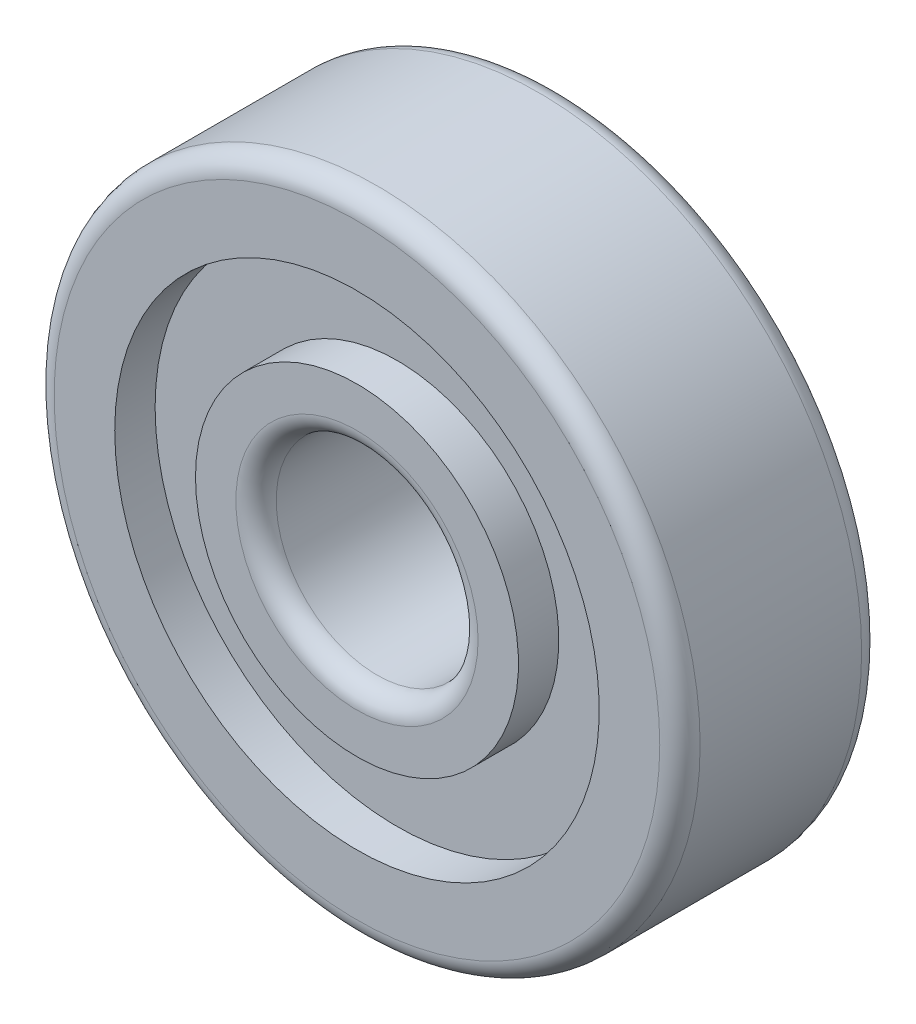
ISO-10303-21;
HEADER;
FILE_DESCRIPTION(('STEP AP214'),'2;1');
FILE_NAME('part.step','',(''),(''),'','','');
FILE_SCHEMA(('AUTOMOTIVE_DESIGN { 1 0 10303 214 1 1 1 1 }'));
ENDSEC;
DATA;
#1=APPLICATION_CONTEXT('core data for automotive mechanical design processes');
#2=APPLICATION_PROTOCOL_DEFINITION('international standard','automotive_design',2000,#1);
#3=PRODUCT_CONTEXT('',#1,'mechanical');
#4=PRODUCT('Part','Part','',(#3));
#5=PRODUCT_RELATED_PRODUCT_CATEGORY('part','',(#4));
#6=PRODUCT_DEFINITION_FORMATION('','',#4);
#7=PRODUCT_DEFINITION_CONTEXT('part definition',#1,'design');
#8=PRODUCT_DEFINITION('design','',#6,#7);
#9=PRODUCT_DEFINITION_SHAPE('','',#8);
#10=(LENGTH_UNIT() NAMED_UNIT(*) SI_UNIT(.MILLI.,.METRE.));
#11=(NAMED_UNIT(*) PLANE_ANGLE_UNIT() SI_UNIT($,.RADIAN.));
#12=(NAMED_UNIT(*) SI_UNIT($,.STERADIAN.) SOLID_ANGLE_UNIT());
#13=UNCERTAINTY_MEASURE_WITH_UNIT(LENGTH_MEASURE(1.E-05),#10,'distance_accuracy_value','');
#14=(GEOMETRIC_REPRESENTATION_CONTEXT(3) GLOBAL_UNCERTAINTY_ASSIGNED_CONTEXT((#13)) GLOBAL_UNIT_ASSIGNED_CONTEXT((#10,
#11,#12)) REPRESENTATION_CONTEXT('',''));
#15=CARTESIAN_POINT('',(0.,0.,0.));
#16=DIRECTION('',(0.,0.,1.));
#17=DIRECTION('',(1.,0.,0.));
#18=AXIS2_PLACEMENT_3D('',#15,#16,#17);
#19=CARTESIAN_POINT('',(0.,0.,2.5));
#20=DIRECTION('',(0.,0.,1.));
#21=DIRECTION('',(1.,0.,0.));
#22=AXIS2_PLACEMENT_3D('',#19,#20,#21);
#23=PLANE('',#22);
#24=CARTESIAN_POINT('',(0.,0.,2.5));
#25=DIRECTION('',(0.,0.,1.));
#26=DIRECTION('',(1.,0.,0.));
#27=AXIS2_PLACEMENT_3D('',#24,#25,#26);
#28=CIRCLE('',#27,3.);
#29=CARTESIAN_POINT('',(3.,0.,2.5));
#30=VERTEX_POINT('',#29);
#31=EDGE_CURVE('E45',#30,#30,#28,.F.);
#32=ORIENTED_EDGE('',*,*,#31,.T.);
#33=EDGE_LOOP('',(#32));
#34=FACE_BOUND('',#33,.T.);
#35=CARTESIAN_POINT('',(0.,0.,2.5));
#36=DIRECTION('',(0.,0.,-1.));
#37=DIRECTION('',(-1.,0.,0.));
#38=AXIS2_PLACEMENT_3D('',#35,#36,#37);
#39=CIRCLE('',#38,4.);
#40=CARTESIAN_POINT('',(-4.,0.,2.5));
#41=VERTEX_POINT('',#40);
#42=EDGE_CURVE('E85',#41,#41,#39,.T.);
#43=ORIENTED_EDGE('',*,*,#42,.F.);
#44=EDGE_LOOP('',(#43));
#45=FACE_BOUND('',#44,.T.);
#46=ADVANCED_FACE('F34',(#34,#45),#23,.T.);
#47=CARTESIAN_POINT('',(0.,0.,-2.5));
#48=DIRECTION('',(0.,0.,1.));
#49=DIRECTION('',(1.,0.,0.));
#50=AXIS2_PLACEMENT_3D('',#47,#48,#49);
#51=PLANE('',#50);
#52=CARTESIAN_POINT('',(0.,0.,-2.5));
#53=DIRECTION('',(0.,0.,1.));
#54=DIRECTION('',(1.,0.,0.));
#55=AXIS2_PLACEMENT_3D('',#52,#53,#54);
#56=CIRCLE('',#55,3.);
#57=CARTESIAN_POINT('',(3.,0.,-2.5));
#58=VERTEX_POINT('',#57);
#59=EDGE_CURVE('E60',#58,#58,#56,.T.);
#60=ORIENTED_EDGE('',*,*,#59,.T.);
#61=EDGE_LOOP('',(#60));
#62=FACE_BOUND('',#61,.T.);
#63=CARTESIAN_POINT('',(0.,0.,-2.5));
#64=DIRECTION('',(0.,0.,-1.));
#65=DIRECTION('',(-1.,0.,0.));
#66=AXIS2_PLACEMENT_3D('',#63,#64,#65);
#67=CIRCLE('',#66,4.);
#68=CARTESIAN_POINT('',(-4.,0.,-2.5));
#69=VERTEX_POINT('',#68);
#70=EDGE_CURVE('E73',#69,#69,#67,.T.);
#71=ORIENTED_EDGE('',*,*,#70,.T.);
#72=EDGE_LOOP('',(#71));
#73=FACE_BOUND('',#72,.T.);
#74=ADVANCED_FACE('F101',(#62,#73),#51,.F.);
#75=CARTESIAN_POINT('',(0.,0.,2.5));
#76=DIRECTION('',(0.,0.,-1.));
#77=DIRECTION('',(-1.,0.,0.));
#78=AXIS2_PLACEMENT_3D('',#75,#76,#77);
#79=CIRCLE('',#78,6.);
#80=CARTESIAN_POINT('',(-6.,0.,2.5));
#81=VERTEX_POINT('',#80);
#82=EDGE_CURVE('E79',#81,#81,#79,.T.);
#83=ORIENTED_EDGE('',*,*,#82,.T.);
#84=EDGE_LOOP('',(#83));
#85=FACE_BOUND('',#84,.T.);
#86=CARTESIAN_POINT('',(0.,0.,2.5));
#87=DIRECTION('',(0.,0.,1.));
#88=DIRECTION('',(1.,0.,0.));
#89=AXIS2_PLACEMENT_3D('',#86,#87,#88);
#90=CIRCLE('',#89,7.5);
#91=CARTESIAN_POINT('',(7.5,0.,2.5));
#92=VERTEX_POINT('',#91);
#93=EDGE_CURVE('E49',#92,#92,#90,.T.);
#94=ORIENTED_EDGE('',*,*,#93,.T.);
#95=EDGE_LOOP('',(#94));
#96=FACE_BOUND('',#95,.T.);
#97=ADVANCED_FACE('F104',(#85,#96),#23,.T.);
#98=CARTESIAN_POINT('',(0.,0.,-2.5));
#99=DIRECTION('',(0.,0.,-1.));
#100=DIRECTION('',(-1.,0.,0.));
#101=AXIS2_PLACEMENT_3D('',#98,#99,#100);
#102=CIRCLE('',#101,6.);
#103=CARTESIAN_POINT('',(-6.,0.,-2.5));
#104=VERTEX_POINT('',#103);
#105=EDGE_CURVE('E67',#104,#104,#102,.T.);
#106=ORIENTED_EDGE('',*,*,#105,.F.);
#107=EDGE_LOOP('',(#106));
#108=FACE_BOUND('',#107,.T.);
#109=CARTESIAN_POINT('',(0.,0.,-2.5));
#110=DIRECTION('',(0.,0.,1.));
#111=DIRECTION('',(1.,0.,0.));
#112=AXIS2_PLACEMENT_3D('',#109,#110,#111);
#113=CIRCLE('',#112,7.5);
#114=CARTESIAN_POINT('',(7.5,0.,-2.5));
#115=VERTEX_POINT('',#114);
#116=EDGE_CURVE('E63',#115,#115,#113,.F.);
#117=ORIENTED_EDGE('',*,*,#116,.T.);
#118=EDGE_LOOP('',(#117));
#119=FACE_BOUND('',#118,.T.);
#120=ADVANCED_FACE('F110',(#108,#119),#51,.F.);
#121=CARTESIAN_POINT('',(0.,0.,2.5));
#122=DIRECTION('',(0.,0.,-1.));
#123=DIRECTION('',(-1.,0.,0.));
#124=AXIS2_PLACEMENT_3D('',#121,#122,#123);
#125=CYLINDRICAL_SURFACE('',#124,8.);
#126=CARTESIAN_POINT('',(0.,0.,-2.));
#127=DIRECTION('',(0.,0.,1.));
#128=DIRECTION('',(1.,0.,0.));
#129=AXIS2_PLACEMENT_3D('',#126,#127,#128);
#130=CIRCLE('',#129,8.);
#131=CARTESIAN_POINT('',(8.,0.,-2.));
#132=VERTEX_POINT('',#131);
#133=EDGE_CURVE('E10',#132,#132,#130,.T.);
#134=ORIENTED_EDGE('',*,*,#133,.T.);
#135=EDGE_LOOP('',(#134));
#136=FACE_BOUND('',#135,.T.);
#137=CARTESIAN_POINT('',(0.,0.,2.));
#138=DIRECTION('',(0.,0.,1.));
#139=DIRECTION('',(1.,0.,0.));
#140=AXIS2_PLACEMENT_3D('',#137,#138,#139);
#141=CIRCLE('',#140,8.);
#142=CARTESIAN_POINT('',(8.,0.,2.));
#143=VERTEX_POINT('',#142);
#144=EDGE_CURVE('E41',#143,#143,#141,.F.);
#145=ORIENTED_EDGE('',*,*,#144,.T.);
#146=EDGE_LOOP('',(#145));
#147=FACE_BOUND('',#146,.T.);
#148=ADVANCED_FACE('F117',(#136,#147),#125,.T.);
#149=CARTESIAN_POINT('',(0.,0.,2.5));
#150=DIRECTION('',(0.,0.,-1.));
#151=DIRECTION('',(-1.,0.,0.));
#152=AXIS2_PLACEMENT_3D('',#149,#150,#151);
#153=CYLINDRICAL_SURFACE('',#152,2.5);
#154=CARTESIAN_POINT('',(0.,0.,-2.));
#155=DIRECTION('',(0.,0.,1.));
#156=DIRECTION('',(1.,0.,0.));
#157=AXIS2_PLACEMENT_3D('',#154,#155,#156);
#158=CIRCLE('',#157,2.5);
#159=CARTESIAN_POINT('',(2.5,0.,-2.));
#160=VERTEX_POINT('',#159);
#161=EDGE_CURVE('E54',#160,#160,#158,.F.);
#162=ORIENTED_EDGE('',*,*,#161,.T.);
#163=EDGE_LOOP('',(#162));
#164=FACE_BOUND('',#163,.T.);
#165=CARTESIAN_POINT('',(0.,0.,2.));
#166=DIRECTION('',(0.,0.,1.));
#167=DIRECTION('',(1.,0.,0.));
#168=AXIS2_PLACEMENT_3D('',#165,#166,#167);
#169=CIRCLE('',#168,2.5);
#170=CARTESIAN_POINT('',(2.5,0.,2.));
#171=VERTEX_POINT('',#170);
#172=EDGE_CURVE('E57',#171,#171,#169,.T.);
#173=ORIENTED_EDGE('',*,*,#172,.T.);
#174=EDGE_LOOP('',(#173));
#175=FACE_BOUND('',#174,.T.);
#176=ADVANCED_FACE('F147',(#164,#175),#153,.F.);
#177=CARTESIAN_POINT('',(0.,0.,-2.));
#178=DIRECTION('',(0.,0.,1.));
#179=DIRECTION('',(1.,0.,0.));
#180=AXIS2_PLACEMENT_3D('',#177,#178,#179);
#181=TOROIDAL_SURFACE('',#180,3.,0.5);
#182=ORIENTED_EDGE('',*,*,#161,.F.);
#183=EDGE_LOOP('',(#182));
#184=FACE_BOUND('',#183,.T.);
#185=ORIENTED_EDGE('',*,*,#59,.F.);
#186=EDGE_LOOP('',(#185));
#187=FACE_BOUND('',#186,.T.);
#188=ADVANCED_FACE('F139',(#184,#187),#181,.T.);
#189=CARTESIAN_POINT('',(0.,0.,2.));
#190=DIRECTION('',(0.,0.,1.));
#191=DIRECTION('',(1.,0.,0.));
#192=AXIS2_PLACEMENT_3D('',#189,#190,#191);
#193=TOROIDAL_SURFACE('',#192,3.,0.5);
#194=ORIENTED_EDGE('',*,*,#31,.F.);
#195=EDGE_LOOP('',(#194));
#196=FACE_BOUND('',#195,.T.);
#197=ORIENTED_EDGE('',*,*,#172,.F.);
#198=EDGE_LOOP('',(#197));
#199=FACE_BOUND('',#198,.T.);
#200=ADVANCED_FACE('F134',(#196,#199),#193,.T.);
#201=CARTESIAN_POINT('',(0.,0.,-2.));
#202=DIRECTION('',(0.,0.,1.));
#203=DIRECTION('',(1.,0.,0.));
#204=AXIS2_PLACEMENT_3D('',#201,#202,#203);
#205=TOROIDAL_SURFACE('',#204,7.5,0.5);
#206=ORIENTED_EDGE('',*,*,#116,.F.);
#207=EDGE_LOOP('',(#206));
#208=FACE_BOUND('',#207,.T.);
#209=ORIENTED_EDGE('',*,*,#133,.F.);
#210=EDGE_LOOP('',(#209));
#211=FACE_BOUND('',#210,.T.);
#212=ADVANCED_FACE('F125',(#208,#211),#205,.T.);
#213=CARTESIAN_POINT('',(0.,0.,2.));
#214=DIRECTION('',(0.,0.,1.));
#215=DIRECTION('',(1.,0.,0.));
#216=AXIS2_PLACEMENT_3D('',#213,#214,#215);
#217=TOROIDAL_SURFACE('',#216,7.5,0.5);
#218=ORIENTED_EDGE('',*,*,#144,.F.);
#219=EDGE_LOOP('',(#218));
#220=FACE_BOUND('',#219,.T.);
#221=ORIENTED_EDGE('',*,*,#93,.F.);
#222=EDGE_LOOP('',(#221));
#223=FACE_BOUND('',#222,.T.);
#224=ADVANCED_FACE('F36',(#220,#223),#217,.T.);
#225=CARTESIAN_POINT('',(0.,0.,-1.5));
#226=DIRECTION('',(0.,0.,-1.));
#227=DIRECTION('',(-1.,0.,0.));
#228=AXIS2_PLACEMENT_3D('',#225,#226,#227);
#229=CYLINDRICAL_SURFACE('',#228,6.);
#230=CARTESIAN_POINT('',(0.,0.,-1.5));
#231=DIRECTION('',(0.,0.,-1.));
#232=DIRECTION('',(-1.,0.,0.));
#233=AXIS2_PLACEMENT_3D('',#230,#231,#232);
#234=CIRCLE('',#233,6.);
#235=CARTESIAN_POINT('',(-6.,0.,-1.5));
#236=VERTEX_POINT('',#235);
#237=EDGE_CURVE('E66',#236,#236,#234,.T.);
#238=ORIENTED_EDGE('',*,*,#237,.F.);
#239=EDGE_LOOP('',(#238));
#240=FACE_BOUND('',#239,.T.);
#241=ORIENTED_EDGE('',*,*,#105,.T.);
#242=EDGE_LOOP('',(#241));
#243=FACE_BOUND('',#242,.T.);
#244=ADVANCED_FACE('F124',(#240,#243),#229,.F.);
#245=CARTESIAN_POINT('',(0.,0.,-1.5));
#246=DIRECTION('',(0.,0.,-1.));
#247=DIRECTION('',(-1.,0.,0.));
#248=AXIS2_PLACEMENT_3D('',#245,#246,#247);
#249=PLANE('',#248);
#250=CARTESIAN_POINT('',(0.,0.,-1.5));
#251=DIRECTION('',(0.,0.,-1.));
#252=DIRECTION('',(-1.,0.,0.));
#253=AXIS2_PLACEMENT_3D('',#250,#251,#252);
#254=CIRCLE('',#253,4.);
#255=CARTESIAN_POINT('',(-4.,0.,-1.5));
#256=VERTEX_POINT('',#255);
#257=EDGE_CURVE('E70',#256,#256,#254,.T.);
#258=ORIENTED_EDGE('',*,*,#257,.F.);
#259=EDGE_LOOP('',(#258));
#260=FACE_BOUND('',#259,.T.);
#261=ORIENTED_EDGE('',*,*,#237,.T.);
#262=EDGE_LOOP('',(#261));
#263=FACE_BOUND('',#262,.T.);
#264=ADVANCED_FACE('F131',(#260,#263),#249,.T.);
#265=CARTESIAN_POINT('',(0.,0.,-1.5));
#266=DIRECTION('',(0.,0.,-1.));
#267=DIRECTION('',(-1.,0.,0.));
#268=AXIS2_PLACEMENT_3D('',#265,#266,#267);
#269=CYLINDRICAL_SURFACE('',#268,4.);
#270=ORIENTED_EDGE('',*,*,#257,.T.);
#271=EDGE_LOOP('',(#270));
#272=FACE_BOUND('',#271,.T.);
#273=ORIENTED_EDGE('',*,*,#70,.F.);
#274=EDGE_LOOP('',(#273));
#275=FACE_BOUND('',#274,.T.);
#276=ADVANCED_FACE('F160',(#272,#275),#269,.T.);
#277=CARTESIAN_POINT('',(0.,0.,1.5));
#278=DIRECTION('',(0.,0.,1.));
#279=DIRECTION('',(-1.,0.,0.));
#280=AXIS2_PLACEMENT_3D('',#277,#278,#279);
#281=PLANE('',#280);
#282=CARTESIAN_POINT('',(0.,0.,1.5));
#283=DIRECTION('',(0.,0.,-1.));
#284=DIRECTION('',(-1.,0.,0.));
#285=AXIS2_PLACEMENT_3D('',#282,#283,#284);
#286=CIRCLE('',#285,6.);
#287=CARTESIAN_POINT('',(-6.,0.,1.5));
#288=VERTEX_POINT('',#287);
#289=EDGE_CURVE('E76',#288,#288,#286,.T.);
#290=ORIENTED_EDGE('',*,*,#289,.F.);
#291=EDGE_LOOP('',(#290));
#292=FACE_BOUND('',#291,.T.);
#293=CARTESIAN_POINT('',(0.,0.,1.5));
#294=DIRECTION('',(0.,0.,-1.));
#295=DIRECTION('',(-1.,0.,0.));
#296=AXIS2_PLACEMENT_3D('',#293,#294,#295);
#297=CIRCLE('',#296,4.);
#298=CARTESIAN_POINT('',(-4.,0.,1.5));
#299=VERTEX_POINT('',#298);
#300=EDGE_CURVE('E82',#299,#299,#297,.T.);
#301=ORIENTED_EDGE('',*,*,#300,.T.);
#302=EDGE_LOOP('',(#301));
#303=FACE_BOUND('',#302,.T.);
#304=ADVANCED_FACE('F91',(#292,#303),#281,.T.);
#305=CARTESIAN_POINT('',(0.,0.,1.5));
#306=DIRECTION('',(0.,0.,1.));
#307=DIRECTION('',(1.,0.,0.));
#308=AXIS2_PLACEMENT_3D('',#305,#306,#307);
#309=CYLINDRICAL_SURFACE('',#308,6.);
#310=ORIENTED_EDGE('',*,*,#289,.T.);
#311=EDGE_LOOP('',(#310));
#312=FACE_BOUND('',#311,.T.);
#313=ORIENTED_EDGE('',*,*,#82,.F.);
#314=EDGE_LOOP('',(#313));
#315=FACE_BOUND('',#314,.T.);
#316=ADVANCED_FACE('F96',(#312,#315),#309,.F.);
#317=CARTESIAN_POINT('',(0.,0.,1.5));
#318=DIRECTION('',(0.,0.,1.));
#319=DIRECTION('',(1.,0.,0.));
#320=AXIS2_PLACEMENT_3D('',#317,#318,#319);
#321=CYLINDRICAL_SURFACE('',#320,4.);
#322=ORIENTED_EDGE('',*,*,#300,.F.);
#323=EDGE_LOOP('',(#322));
#324=FACE_BOUND('',#323,.T.);
#325=ORIENTED_EDGE('',*,*,#42,.T.);
#326=EDGE_LOOP('',(#325));
#327=FACE_BOUND('',#326,.T.);
#328=ADVANCED_FACE('F93',(#324,#327),#321,.T.);
#329=CLOSED_SHELL('',(#46,#74,#97,#120,#148,#176,#188,#200,#212,#224,#244,#264,#276,#304,#316,#328));
#330=MANIFOLD_SOLID_BREP('B2',#329);
#331=ADVANCED_BREP_SHAPE_REPRESENTATION('',(#18,#330),#14);
#332=SHAPE_DEFINITION_REPRESENTATION(#9,#331);
ENDSEC;
END-ISO-10303-21;
